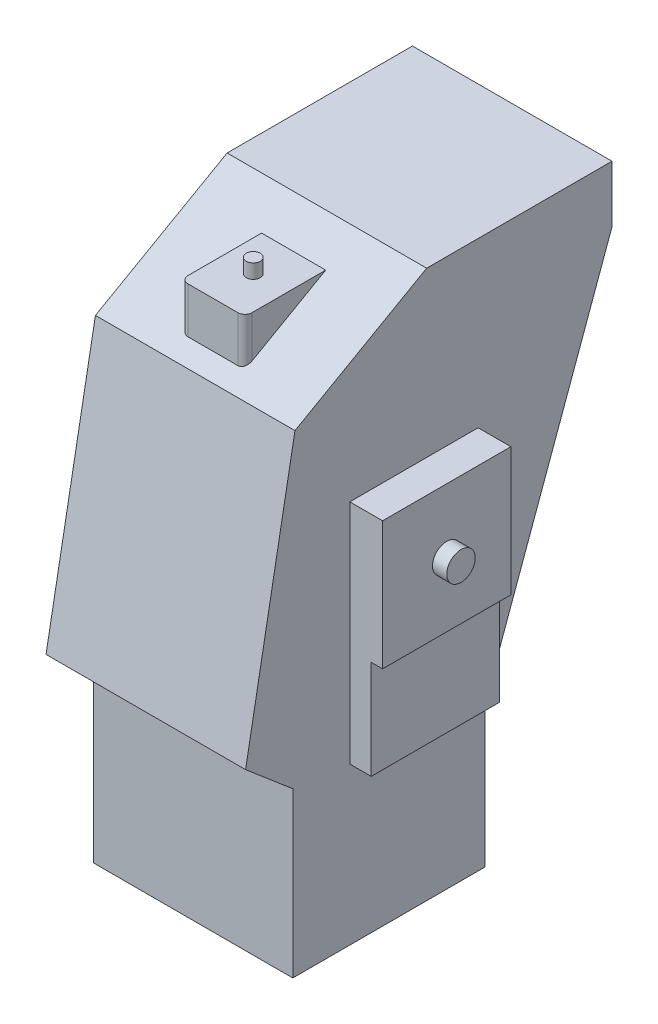
ISO-10303-21;
HEADER;
FILE_DESCRIPTION(('STEP AP214'),'2;1');
FILE_NAME('part.step','',(''),(''),'','','');
FILE_SCHEMA(('AUTOMOTIVE_DESIGN { 1 0 10303 214 1 1 1 1 }'));
ENDSEC;
DATA;
#1=APPLICATION_CONTEXT('core data for automotive mechanical design processes');
#2=APPLICATION_PROTOCOL_DEFINITION('international standard','automotive_design',2000,#1);
#3=PRODUCT_CONTEXT('',#1,'mechanical');
#4=PRODUCT('Part','Part','',(#3));
#5=PRODUCT_RELATED_PRODUCT_CATEGORY('part','',(#4));
#6=PRODUCT_DEFINITION_FORMATION('','',#4);
#7=PRODUCT_DEFINITION_CONTEXT('part definition',#1,'design');
#8=PRODUCT_DEFINITION('design','',#6,#7);
#9=PRODUCT_DEFINITION_SHAPE('','',#8);
#10=(LENGTH_UNIT() NAMED_UNIT(*) SI_UNIT(.MILLI.,.METRE.));
#11=(NAMED_UNIT(*) PLANE_ANGLE_UNIT() SI_UNIT($,.RADIAN.));
#12=(NAMED_UNIT(*) SI_UNIT($,.STERADIAN.) SOLID_ANGLE_UNIT());
#13=UNCERTAINTY_MEASURE_WITH_UNIT(LENGTH_MEASURE(1.E-05),#10,'distance_accuracy_value','');
#14=(GEOMETRIC_REPRESENTATION_CONTEXT(3) GLOBAL_UNCERTAINTY_ASSIGNED_CONTEXT((#13)) GLOBAL_UNIT_ASSIGNED_CONTEXT((#10,
#11,#12)) REPRESENTATION_CONTEXT('',''));
#15=CARTESIAN_POINT('',(0.,0.,0.));
#16=DIRECTION('',(0.,0.,1.));
#17=DIRECTION('',(1.,0.,0.));
#18=AXIS2_PLACEMENT_3D('',#15,#16,#17);
#19=CARTESIAN_POINT('',(23.,0.,0.));
#20=DIRECTION('',(1.,0.,0.));
#21=DIRECTION('',(0.,0.,-1.));
#22=AXIS2_PLACEMENT_3D('',#19,#20,#21);
#23=PLANE('',#22);
#24=DIRECTION('',(0.,-1.,0.));
#25=VECTOR('',#24,1.);
#26=CARTESIAN_POINT('',(23.,149.999954134958,82.5759610045894));
#27=LINE('',#26,#25);
#28=CARTESIAN_POINT('',(23.,149.999954134958,82.5759610045894));
#29=VERTEX_POINT('',#28);
#30=CARTESIAN_POINT('',(23.,59.9999541349582,82.5759610045894));
#31=VERTEX_POINT('',#30);
#32=EDGE_CURVE('E282',#29,#31,#27,.T.);
#33=ORIENTED_EDGE('',*,*,#32,.T.);
#34=DIRECTION('',(0.,0.,-1.));
#35=VECTOR('',#34,1.);
#36=CARTESIAN_POINT('',(23.,59.9999541349582,82.5759610045894));
#37=LINE('',#36,#35);
#38=CARTESIAN_POINT('',(23.,59.9999541349582,-7.42403899541063));
#39=VERTEX_POINT('',#38);
#40=EDGE_CURVE('E285',#31,#39,#37,.T.);
#41=ORIENTED_EDGE('',*,*,#40,.T.);
#42=DIRECTION('',(0.,1.,0.));
#43=VECTOR('',#42,1.);
#44=CARTESIAN_POINT('',(23.,149.999954134958,-7.42403899541062));
#45=LINE('',#44,#43);
#46=CARTESIAN_POINT('',(23.,149.999954134958,-7.42403899541062));
#47=VERTEX_POINT('',#46);
#48=EDGE_CURVE('E287',#39,#47,#45,.T.);
#49=ORIENTED_EDGE('',*,*,#48,.T.);
#50=DIRECTION('',(0.,0.,1.));
#51=VECTOR('',#50,1.);
#52=CARTESIAN_POINT('',(23.,149.999954134958,82.5759610045894));
#53=LINE('',#52,#51);
#54=EDGE_CURVE('E290',#47,#29,#53,.T.);
#55=ORIENTED_EDGE('',*,*,#54,.T.);
#56=EDGE_LOOP('',(#33,#41,#49,#55));
#57=FACE_BOUND('',#56,.T.);
#58=CARTESIAN_POINT('',(23.,104.999954134958,37.5759610045894));
#59=DIRECTION('',(1.,0.,0.));
#60=DIRECTION('',(0.,0.,-1.));
#61=AXIS2_PLACEMENT_3D('',#58,#59,#60);
#62=CIRCLE('',#61,10.);
#63=CARTESIAN_POINT('',(23.,104.999954134958,27.5759610045894));
#64=VERTEX_POINT('',#63);
#65=EDGE_CURVE('E275',#64,#64,#62,.T.);
#66=ORIENTED_EDGE('',*,*,#65,.F.);
#67=EDGE_LOOP('',(#66));
#68=FACE_BOUND('',#67,.T.);
#69=ADVANCED_FACE('F32',(#57,#68),#23,.T.);
#70=CARTESIAN_POINT('',(15.,0.,0.));
#71=DIRECTION('',(-1.,0.,0.));
#72=DIRECTION('',(0.,0.,1.));
#73=AXIS2_PLACEMENT_3D('',#70,#71,#72);
#74=PLANE('',#73);
#75=DIRECTION('',(0.,0.,-1.));
#76=VECTOR('',#75,1.);
#77=CARTESIAN_POINT('',(15.,59.9999541349582,82.5759610045894));
#78=LINE('',#77,#76);
#79=CARTESIAN_POINT('',(15.,59.9999541349582,82.5759610045894));
#80=VERTEX_POINT('',#79);
#81=CARTESIAN_POINT('',(15.,59.9999541349582,-7.42403899541063));
#82=VERTEX_POINT('',#81);
#83=EDGE_CURVE('E279',#80,#82,#78,.T.);
#84=ORIENTED_EDGE('',*,*,#83,.F.);
#85=DIRECTION('',(0.,-1.,0.));
#86=VECTOR('',#85,1.);
#87=CARTESIAN_POINT('',(15.,149.999954134958,82.5759610045894));
#88=LINE('',#87,#86);
#89=CARTESIAN_POINT('',(15.,-9.32012726937813,82.5759610045894));
#90=VERTEX_POINT('',#89);
#91=EDGE_CURVE('E302',#80,#90,#88,.T.);
#92=ORIENTED_EDGE('',*,*,#91,.T.);
#93=DIRECTION('',(0.,0.,-1.));
#94=VECTOR('',#93,1.);
#95=CARTESIAN_POINT('',(15.,-9.32012726937811,-7.42403899541063));
#96=LINE('',#95,#94);
#97=CARTESIAN_POINT('',(15.,-9.32012726937811,-7.42403899541063));
#98=VERTEX_POINT('',#97);
#99=EDGE_CURVE('E325',#90,#98,#96,.T.);
#100=ORIENTED_EDGE('',*,*,#99,.T.);
#101=DIRECTION('',(0.,1.,0.));
#102=VECTOR('',#101,1.);
#103=CARTESIAN_POINT('',(15.,149.999954134958,-7.42403899541061));
#104=LINE('',#103,#102);
#105=EDGE_CURVE('E331',#98,#82,#104,.T.);
#106=ORIENTED_EDGE('',*,*,#105,.T.);
#107=EDGE_LOOP('',(#84,#92,#100,#106));
#108=FACE_BOUND('',#107,.T.);
#109=ADVANCED_FACE('F460',(#108),#74,.F.);
#110=CARTESIAN_POINT('',(0.,0.,0.));
#111=DIRECTION('',(1.,0.,0.));
#112=DIRECTION('',(0.,0.,-1.));
#113=AXIS2_PLACEMENT_3D('',#110,#111,#112);
#114=PLANE('',#113);
#115=DIRECTION('',(0.,-0.493861860804956,0.869540374245076));
#116=VECTOR('',#115,1.);
#117=CARTESIAN_POINT('',(0.,212.517254187215,121.05677931094));
#118=LINE('',#117,#116);
#119=CARTESIAN_POINT('',(0.,264.999954134958,28.6507237399155));
#120=VERTEX_POINT('',#119);
#121=CARTESIAN_POINT('',(0.,212.517254187215,121.05677931094));
#122=VERTEX_POINT('',#121);
#123=EDGE_CURVE('E366',#120,#122,#118,.T.);
#124=ORIENTED_EDGE('',*,*,#123,.T.);
#125=DIRECTION('',(0.,-0.983554856780202,0.180609644548892));
#126=VECTOR('',#125,1.);
#127=CARTESIAN_POINT('',(0.,23.8419260110692,155.703127424754));
#128=LINE('',#127,#126);
#129=CARTESIAN_POINT('',(0.,23.8419260110692,155.703127424754));
#130=VERTEX_POINT('',#129);
#131=EDGE_CURVE('E398',#122,#130,#128,.T.);
#132=ORIENTED_EDGE('',*,*,#131,.T.);
#133=DIRECTION('',(0.,-0.647701317397593,-0.761894351889697));
#134=VECTOR('',#133,1.);
#135=CARTESIAN_POINT('',(0.,-4.32012726937812,122.575961004589));
#136=LINE('',#135,#134);
#137=CARTESIAN_POINT('',(0.,-4.32012726937812,122.575961004589));
#138=VERTEX_POINT('',#137);
#139=EDGE_CURVE('E401',#130,#138,#136,.T.);
#140=ORIENTED_EDGE('',*,*,#139,.T.);
#141=DIRECTION('',(0.,-1.,0.));
#142=VECTOR('',#141,1.);
#143=CARTESIAN_POINT('',(0.,-119.320127269378,122.575961004589));
#144=LINE('',#143,#142);
#145=CARTESIAN_POINT('',(0.,-119.320127269378,122.575961004589));
#146=VERTEX_POINT('',#145);
#147=EDGE_CURVE('E404',#138,#146,#144,.T.);
#148=ORIENTED_EDGE('',*,*,#147,.T.);
#149=DIRECTION('',(0.,0.,-1.));
#150=VECTOR('',#149,1.);
#151=CARTESIAN_POINT('',(0.,-119.320127269378,-12.4240389954106));
#152=LINE('',#151,#150);
#153=CARTESIAN_POINT('',(0.,-119.320127269378,-12.4240389954106));
#154=VERTEX_POINT('',#153);
#155=EDGE_CURVE('E407',#146,#154,#152,.T.);
#156=ORIENTED_EDGE('',*,*,#155,.T.);
#157=DIRECTION('',(0.,1.,0.));
#158=VECTOR('',#157,1.);
#159=CARTESIAN_POINT('',(0.,-19.320127269378,-12.4240389954105));
#160=LINE('',#159,#158);
#161=CARTESIAN_POINT('',(0.,-19.320127269378,-12.4240389954105));
#162=VERTEX_POINT('',#161);
#163=EDGE_CURVE('E410',#154,#162,#160,.T.);
#164=ORIENTED_EDGE('',*,*,#163,.T.);
#165=DIRECTION('',(0.,0.939692620785908,-0.342020143325669));
#166=VECTOR('',#165,1.);
#167=CARTESIAN_POINT('',(0.,224.999954134958,-101.349276260085));
#168=LINE('',#167,#166);
#169=CARTESIAN_POINT('',(0.,224.999954134958,-101.349276260085));
#170=VERTEX_POINT('',#169);
#171=EDGE_CURVE('E413',#162,#170,#168,.T.);
#172=ORIENTED_EDGE('',*,*,#171,.T.);
#173=DIRECTION('',(0.,1.,0.));
#174=VECTOR('',#173,1.);
#175=CARTESIAN_POINT('',(0.,264.999954134958,-101.349276260085));
#176=LINE('',#175,#174);
#177=CARTESIAN_POINT('',(0.,264.999954134958,-101.349276260085));
#178=VERTEX_POINT('',#177);
#179=EDGE_CURVE('E416',#170,#178,#176,.T.);
#180=ORIENTED_EDGE('',*,*,#179,.T.);
#181=DIRECTION('',(0.,0.,1.));
#182=VECTOR('',#181,1.);
#183=CARTESIAN_POINT('',(0.,264.999954134958,28.6507237399155));
#184=LINE('',#183,#182);
#185=EDGE_CURVE('E371',#178,#120,#184,.T.);
#186=ORIENTED_EDGE('',*,*,#185,.T.);
#187=EDGE_LOOP('',(#124,#132,#140,#148,#156,#164,#172,#180,#186));
#188=FACE_BOUND('',#187,.T.);
#189=DIRECTION('',(0.,0.,1.));
#190=VECTOR('',#189,1.);
#191=CARTESIAN_POINT('',(0.,149.999954134958,-7.42403899541061));
#192=LINE('',#191,#190);
#193=CARTESIAN_POINT('',(0.,149.999954134958,-7.42403899541061));
#194=VERTEX_POINT('',#193);
#195=CARTESIAN_POINT('',(0.,149.999954134958,82.5759610045894));
#196=VERTEX_POINT('',#195);
#197=EDGE_CURVE('E316',#194,#196,#192,.T.);
#198=ORIENTED_EDGE('',*,*,#197,.F.);
#199=DIRECTION('',(0.,1.,0.));
#200=VECTOR('',#199,1.);
#201=CARTESIAN_POINT('',(0.,149.999954134958,-7.42403899541061));
#202=LINE('',#201,#200);
#203=CARTESIAN_POINT('',(0.,-9.32012726937811,-7.42403899541063));
#204=VERTEX_POINT('',#203);
#205=EDGE_CURVE('E311',#204,#194,#202,.T.);
#206=ORIENTED_EDGE('',*,*,#205,.F.);
#207=DIRECTION('',(0.,0.,-1.));
#208=VECTOR('',#207,1.);
#209=CARTESIAN_POINT('',(0.,-9.32012726937811,-7.42403899541063));
#210=LINE('',#209,#208);
#211=CARTESIAN_POINT('',(0.,-9.32012726937813,82.5759610045894));
#212=VERTEX_POINT('',#211);
#213=EDGE_CURVE('E329',#212,#204,#210,.T.);
#214=ORIENTED_EDGE('',*,*,#213,.F.);
#215=DIRECTION('',(0.,-1.,0.));
#216=VECTOR('',#215,1.);
#217=CARTESIAN_POINT('',(0.,149.999954134958,82.5759610045894));
#218=LINE('',#217,#216);
#219=EDGE_CURVE('E322',#196,#212,#218,.T.);
#220=ORIENTED_EDGE('',*,*,#219,.F.);
#221=EDGE_LOOP('',(#198,#206,#214,#220));
#222=FACE_BOUND('',#221,.T.);
#223=ADVANCED_FACE('F473',(#188,#222),#114,.T.);
#224=CARTESIAN_POINT('',(0.,251.749954134958,4.65830992548263E-13));
#225=DIRECTION('',(0.,1.,0.));
#226=DIRECTION('',(0.,0.,1.));
#227=AXIS2_PLACEMENT_3D('',#224,#225,#226);
#228=PLANE('',#227);
#229=DIRECTION('',(1.,0.,0.));
#230=VECTOR('',#229,1.);
#231=CARTESIAN_POINT('',(-47.5,251.749954134958,108.650723739915));
#232=LINE('',#231,#230);
#233=CARTESIAN_POINT('',(-87.5,251.749954134958,108.650723739915));
#234=VERTEX_POINT('',#233);
#235=CARTESIAN_POINT('',(-52.5,251.749954134958,108.650723739915));
#236=VERTEX_POINT('',#235);
#237=EDGE_CURVE('E360',#234,#236,#232,.T.);
#238=ORIENTED_EDGE('',*,*,#237,.T.);
#239=CARTESIAN_POINT('',(-52.5,251.749954134958,103.650723739915));
#240=DIRECTION('',(0.,1.,0.));
#241=DIRECTION('',(0.,0.,1.));
#242=AXIS2_PLACEMENT_3D('',#239,#240,#241);
#243=CIRCLE('',#242,5.);
#244=CARTESIAN_POINT('',(-47.5,251.749954134958,103.650723739915));
#245=VERTEX_POINT('',#244);
#246=EDGE_CURVE('E445',#236,#245,#243,.T.);
#247=ORIENTED_EDGE('',*,*,#246,.T.);
#248=DIRECTION('',(0.,0.,-1.));
#249=VECTOR('',#248,1.);
#250=CARTESIAN_POINT('',(-47.5,251.749954134958,108.650723739915));
#251=LINE('',#250,#249);
#252=CARTESIAN_POINT('',(-47.5,251.749954134958,51.9799396060045));
#253=VERTEX_POINT('',#252);
#254=EDGE_CURVE('E357',#245,#253,#251,.T.);
#255=ORIENTED_EDGE('',*,*,#254,.T.);
#256=DIRECTION('',(1.,0.,0.));
#257=VECTOR('',#256,1.);
#258=CARTESIAN_POINT('',(0.,251.749954134958,51.9799396060045));
#259=LINE('',#258,#257);
#260=CARTESIAN_POINT('',(-92.5,251.749954134958,51.9799396060045));
#261=VERTEX_POINT('',#260);
#262=EDGE_CURVE('E354',#261,#253,#259,.T.);
#263=ORIENTED_EDGE('',*,*,#262,.F.);
#264=DIRECTION('',(0.,0.,1.));
#265=VECTOR('',#264,1.);
#266=CARTESIAN_POINT('',(-92.5,251.749954134958,108.650723739915));
#267=LINE('',#266,#265);
#268=CARTESIAN_POINT('',(-92.5,251.749954134958,103.650723739915));
#269=VERTEX_POINT('',#268);
#270=EDGE_CURVE('E345',#261,#269,#267,.T.);
#271=ORIENTED_EDGE('',*,*,#270,.T.);
#272=CARTESIAN_POINT('',(-87.5,251.749954134958,103.650723739915));
#273=DIRECTION('',(0.,1.,0.));
#274=DIRECTION('',(0.,0.,1.));
#275=AXIS2_PLACEMENT_3D('',#272,#273,#274);
#276=CIRCLE('',#275,5.);
#277=EDGE_CURVE('E443',#269,#234,#276,.T.);
#278=ORIENTED_EDGE('',*,*,#277,.T.);
#279=EDGE_LOOP('',(#238,#247,#255,#263,#271,#278));
#280=FACE_BOUND('',#279,.T.);
#281=CARTESIAN_POINT('',(-70.7322330470336,251.749954134958,79.5830986259263));
#282=DIRECTION('',(0.,1.,0.));
#283=DIRECTION('',(0.,0.,1.));
#284=AXIS2_PLACEMENT_3D('',#281,#282,#283);
#285=CIRCLE('',#284,4.9);
#286=CARTESIAN_POINT('',(-70.7322330470336,251.749954134958,84.4830986259263));
#287=VERTEX_POINT('',#286);
#288=EDGE_CURVE('E341',#287,#287,#285,.T.);
#289=ORIENTED_EDGE('',*,*,#288,.F.);
#290=EDGE_LOOP('',(#289));
#291=FACE_BOUND('',#290,.T.);
#292=ADVANCED_FACE('F517',(#280,#291),#228,.T.);
#293=CARTESIAN_POINT('',(-140.,212.517254187215,121.05677931094));
#294=DIRECTION('',(0.,0.869540374245076,0.493861860804956));
#295=DIRECTION('',(0.,-0.493861860804956,0.869540374245076));
#296=AXIS2_PLACEMENT_3D('',#293,#294,#295);
#297=PLANE('',#296);
#298=DIRECTION('',(0.,-0.493861860804956,0.869540374245076));
#299=VECTOR('',#298,1.);
#300=CARTESIAN_POINT('',(-47.5,204.054400280119,135.957288415983));
#301=LINE('',#300,#299);
#302=CARTESIAN_POINT('',(-47.5,222.403151666149,103.650723739915));
#303=VERTEX_POINT('',#302);
#304=EDGE_CURVE('E348',#253,#303,#301,.T.);
#305=ORIENTED_EDGE('',*,*,#304,.T.);
#306=CARTESIAN_POINT('',(-52.5,222.403151666149,103.650723739915));
#307=DIRECTION('',(0.,0.869540374245076,0.493861860804956));
#308=DIRECTION('',(0.,0.493861860804956,-0.869540374245076));
#309=AXIS2_PLACEMENT_3D('',#306,#307,#308);
#310=ELLIPSE('',#309,5.75016427999785,5.);
#311=CARTESIAN_POINT('',(-52.5,219.563364834895,108.650723739915));
#312=VERTEX_POINT('',#311);
#313=EDGE_CURVE('E452',#303,#312,#310,.F.);
#314=ORIENTED_EDGE('',*,*,#313,.T.);
#315=DIRECTION('',(-1.,0.,0.));
#316=VECTOR('',#315,1.);
#317=CARTESIAN_POINT('',(-47.5,219.563364834895,108.650723739915));
#318=LINE('',#317,#316);
#319=CARTESIAN_POINT('',(-87.5,219.563364834895,108.650723739915));
#320=VERTEX_POINT('',#319);
#321=EDGE_CURVE('E352',#312,#320,#318,.T.);
#322=ORIENTED_EDGE('',*,*,#321,.T.);
#323=CARTESIAN_POINT('',(-87.5,222.403151666149,103.650723739915));
#324=DIRECTION('',(0.,0.869540374245076,0.493861860804956));
#325=DIRECTION('',(0.,0.493861860804956,-0.869540374245076));
#326=AXIS2_PLACEMENT_3D('',#323,#324,#325);
#327=ELLIPSE('',#326,5.75016427999785,5.);
#328=CARTESIAN_POINT('',(-92.5,222.403151666149,103.650723739915));
#329=VERTEX_POINT('',#328);
#330=EDGE_CURVE('E40',#320,#329,#327,.F.);
#331=ORIENTED_EDGE('',*,*,#330,.T.);
#332=DIRECTION('',(0.,0.493861860804956,-0.869540374245076));
#333=VECTOR('',#332,1.);
#334=CARTESIAN_POINT('',(-92.5,204.054400280119,135.957288415983));
#335=LINE('',#334,#333);
#336=EDGE_CURVE('E351',#329,#261,#335,.T.);
#337=ORIENTED_EDGE('',*,*,#336,.T.);
#338=ORIENTED_EDGE('',*,*,#262,.T.);
#339=EDGE_LOOP('',(#305,#314,#322,#331,#337,#338));
#340=FACE_BOUND('',#339,.T.);
#341=ORIENTED_EDGE('',*,*,#123,.F.);
#342=DIRECTION('',(1.,0.,0.));
#343=VECTOR('',#342,1.);
#344=CARTESIAN_POINT('',(-140.,264.999954134958,28.6507237399155));
#345=LINE('',#344,#343);
#346=CARTESIAN_POINT('',(-140.,264.999954134958,28.6507237399155));
#347=VERTEX_POINT('',#346);
#348=EDGE_CURVE('E421',#347,#120,#345,.T.);
#349=ORIENTED_EDGE('',*,*,#348,.F.);
#350=DIRECTION('',(0.,-0.493861860804956,0.869540374245076));
#351=VECTOR('',#350,1.);
#352=CARTESIAN_POINT('',(-140.,212.517254187215,121.05677931094));
#353=LINE('',#352,#351);
#354=CARTESIAN_POINT('',(-140.,212.517254187215,121.05677931094));
#355=VERTEX_POINT('',#354);
#356=EDGE_CURVE('E367',#347,#355,#353,.T.);
#357=ORIENTED_EDGE('',*,*,#356,.T.);
#358=DIRECTION('',(1.,0.,0.));
#359=VECTOR('',#358,1.);
#360=CARTESIAN_POINT('',(-140.,212.517254187215,121.05677931094));
#361=LINE('',#360,#359);
#362=EDGE_CURVE('E395',#355,#122,#361,.T.);
#363=ORIENTED_EDGE('',*,*,#362,.T.);
#364=EDGE_LOOP('',(#341,#349,#357,#363));
#365=FACE_BOUND('',#364,.T.);
#366=ADVANCED_FACE('F520',(#340,#365),#297,.T.);
#367=CARTESIAN_POINT('',(-140.,264.999954134958,28.6507237399155));
#368=DIRECTION('',(0.,1.,0.));
#369=DIRECTION('',(0.,0.,1.));
#370=AXIS2_PLACEMENT_3D('',#367,#368,#369);
#371=PLANE('',#370);
#372=ORIENTED_EDGE('',*,*,#185,.F.);
#373=DIRECTION('',(1.,0.,0.));
#374=VECTOR('',#373,1.);
#375=CARTESIAN_POINT('',(-140.,264.999954134958,-101.349276260085));
#376=LINE('',#375,#374);
#377=CARTESIAN_POINT('',(-140.,264.999954134958,-101.349276260085));
#378=VERTEX_POINT('',#377);
#379=EDGE_CURVE('E424',#378,#178,#376,.T.);
#380=ORIENTED_EDGE('',*,*,#379,.F.);
#381=DIRECTION('',(0.,0.,1.));
#382=VECTOR('',#381,1.);
#383=CARTESIAN_POINT('',(-140.,264.999954134958,28.6507237399155));
#384=LINE('',#383,#382);
#385=EDGE_CURVE('E392',#378,#347,#384,.T.);
#386=ORIENTED_EDGE('',*,*,#385,.T.);
#387=ORIENTED_EDGE('',*,*,#348,.T.);
#388=EDGE_LOOP('',(#372,#380,#386,#387));
#389=FACE_BOUND('',#388,.T.);
#390=ADVANCED_FACE('F543',(#389),#371,.T.);
#391=CARTESIAN_POINT('',(-140.,264.999954134958,-101.349276260085));
#392=DIRECTION('',(0.,0.,-1.));
#393=DIRECTION('',(-1.,0.,0.));
#394=AXIS2_PLACEMENT_3D('',#391,#392,#393);
#395=PLANE('',#394);
#396=ORIENTED_EDGE('',*,*,#179,.F.);
#397=DIRECTION('',(1.,0.,0.));
#398=VECTOR('',#397,1.);
#399=CARTESIAN_POINT('',(-140.,224.999954134958,-101.349276260085));
#400=LINE('',#399,#398);
#401=CARTESIAN_POINT('',(-140.,224.999954134958,-101.349276260085));
#402=VERTEX_POINT('',#401);
#403=EDGE_CURVE('E426',#402,#170,#400,.T.);
#404=ORIENTED_EDGE('',*,*,#403,.F.);
#405=DIRECTION('',(0.,1.,0.));
#406=VECTOR('',#405,1.);
#407=CARTESIAN_POINT('',(-140.,264.999954134958,-101.349276260085));
#408=LINE('',#407,#406);
#409=EDGE_CURVE('E389',#402,#378,#408,.T.);
#410=ORIENTED_EDGE('',*,*,#409,.T.);
#411=ORIENTED_EDGE('',*,*,#379,.T.);
#412=EDGE_LOOP('',(#396,#404,#410,#411));
#413=FACE_BOUND('',#412,.T.);
#414=ADVANCED_FACE('F546',(#413),#395,.T.);
#415=CARTESIAN_POINT('',(-140.,224.999954134958,-101.349276260085));
#416=DIRECTION('',(0.,-0.342020143325669,-0.939692620785908));
#417=DIRECTION('',(0.,0.939692620785908,-0.342020143325669));
#418=AXIS2_PLACEMENT_3D('',#415,#416,#417);
#419=PLANE('',#418);
#420=ORIENTED_EDGE('',*,*,#171,.F.);
#421=DIRECTION('',(1.,0.,0.));
#422=VECTOR('',#421,1.);
#423=CARTESIAN_POINT('',(-140.,-19.320127269378,-12.4240389954105));
#424=LINE('',#423,#422);
#425=CARTESIAN_POINT('',(-140.,-19.320127269378,-12.4240389954105));
#426=VERTEX_POINT('',#425);
#427=EDGE_CURVE('E428',#426,#162,#424,.T.);
#428=ORIENTED_EDGE('',*,*,#427,.F.);
#429=DIRECTION('',(0.,0.939692620785908,-0.342020143325669));
#430=VECTOR('',#429,1.);
#431=CARTESIAN_POINT('',(-140.,224.999954134958,-101.349276260085));
#432=LINE('',#431,#430);
#433=EDGE_CURVE('E386',#426,#402,#432,.T.);
#434=ORIENTED_EDGE('',*,*,#433,.T.);
#435=ORIENTED_EDGE('',*,*,#403,.T.);
#436=EDGE_LOOP('',(#420,#428,#434,#435));
#437=FACE_BOUND('',#436,.T.);
#438=ADVANCED_FACE('F550',(#437),#419,.T.);
#439=CARTESIAN_POINT('',(-140.,-19.320127269378,-12.4240389954105));
#440=DIRECTION('',(0.,0.,-1.));
#441=DIRECTION('',(0.,1.,0.));
#442=AXIS2_PLACEMENT_3D('',#439,#440,#441);
#443=PLANE('',#442);
#444=ORIENTED_EDGE('',*,*,#163,.F.);
#445=DIRECTION('',(1.,0.,0.));
#446=VECTOR('',#445,1.);
#447=CARTESIAN_POINT('',(-140.,-119.320127269378,-12.4240389954106));
#448=LINE('',#447,#446);
#449=CARTESIAN_POINT('',(-140.,-119.320127269378,-12.4240389954106));
#450=VERTEX_POINT('',#449);
#451=EDGE_CURVE('E430',#450,#154,#448,.T.);
#452=ORIENTED_EDGE('',*,*,#451,.F.);
#453=DIRECTION('',(0.,1.,0.));
#454=VECTOR('',#453,1.);
#455=CARTESIAN_POINT('',(-140.,-19.320127269378,-12.4240389954105));
#456=LINE('',#455,#454);
#457=EDGE_CURVE('E383',#450,#426,#456,.T.);
#458=ORIENTED_EDGE('',*,*,#457,.T.);
#459=ORIENTED_EDGE('',*,*,#427,.T.);
#460=EDGE_LOOP('',(#444,#452,#458,#459));
#461=FACE_BOUND('',#460,.T.);
#462=ADVANCED_FACE('F554',(#461),#443,.T.);
#463=CARTESIAN_POINT('',(-140.,-119.320127269378,-12.4240389954106));
#464=DIRECTION('',(0.,-1.,0.));
#465=DIRECTION('',(0.,0.,-1.));
#466=AXIS2_PLACEMENT_3D('',#463,#464,#465);
#467=PLANE('',#466);
#468=ORIENTED_EDGE('',*,*,#155,.F.);
#469=DIRECTION('',(1.,0.,0.));
#470=VECTOR('',#469,1.);
#471=CARTESIAN_POINT('',(-140.,-119.320127269378,122.575961004589));
#472=LINE('',#471,#470);
#473=CARTESIAN_POINT('',(-140.,-119.320127269378,122.575961004589));
#474=VERTEX_POINT('',#473);
#475=EDGE_CURVE('E432',#474,#146,#472,.T.);
#476=ORIENTED_EDGE('',*,*,#475,.F.);
#477=DIRECTION('',(0.,0.,-1.));
#478=VECTOR('',#477,1.);
#479=CARTESIAN_POINT('',(-140.,-119.320127269378,-12.4240389954106));
#480=LINE('',#479,#478);
#481=EDGE_CURVE('E380',#474,#450,#480,.T.);
#482=ORIENTED_EDGE('',*,*,#481,.T.);
#483=ORIENTED_EDGE('',*,*,#451,.T.);
#484=EDGE_LOOP('',(#468,#476,#482,#483));
#485=FACE_BOUND('',#484,.T.);
#486=ADVANCED_FACE('F558',(#485),#467,.T.);
#487=CARTESIAN_POINT('',(-140.,-119.320127269378,122.575961004589));
#488=DIRECTION('',(0.,0.,1.));
#489=DIRECTION('',(0.,-1.,0.));
#490=AXIS2_PLACEMENT_3D('',#487,#488,#489);
#491=PLANE('',#490);
#492=ORIENTED_EDGE('',*,*,#147,.F.);
#493=DIRECTION('',(1.,0.,0.));
#494=VECTOR('',#493,1.);
#495=CARTESIAN_POINT('',(-140.,-4.32012726937812,122.575961004589));
#496=LINE('',#495,#494);
#497=CARTESIAN_POINT('',(-140.,-4.32012726937812,122.575961004589));
#498=VERTEX_POINT('',#497);
#499=EDGE_CURVE('E434',#498,#138,#496,.T.);
#500=ORIENTED_EDGE('',*,*,#499,.F.);
#501=DIRECTION('',(0.,-1.,0.));
#502=VECTOR('',#501,1.);
#503=CARTESIAN_POINT('',(-140.,-119.320127269378,122.575961004589));
#504=LINE('',#503,#502);
#505=EDGE_CURVE('E377',#498,#474,#504,.T.);
#506=ORIENTED_EDGE('',*,*,#505,.T.);
#507=ORIENTED_EDGE('',*,*,#475,.T.);
#508=EDGE_LOOP('',(#492,#500,#506,#507));
#509=FACE_BOUND('',#508,.T.);
#510=ADVANCED_FACE('F562',(#509),#491,.T.);
#511=CARTESIAN_POINT('',(-140.,-4.32012726937812,122.575961004589));
#512=DIRECTION('',(0.,-0.761894351889697,0.647701317397594));
#513=DIRECTION('',(0.,-0.647701317397594,-0.761894351889697));
#514=AXIS2_PLACEMENT_3D('',#511,#512,#513);
#515=PLANE('',#514);
#516=ORIENTED_EDGE('',*,*,#139,.F.);
#517=DIRECTION('',(1.,0.,0.));
#518=VECTOR('',#517,1.);
#519=CARTESIAN_POINT('',(-140.,23.8419260110692,155.703127424754));
#520=LINE('',#519,#518);
#521=CARTESIAN_POINT('',(-140.,23.8419260110692,155.703127424754));
#522=VERTEX_POINT('',#521);
#523=EDGE_CURVE('E436',#522,#130,#520,.T.);
#524=ORIENTED_EDGE('',*,*,#523,.F.);
#525=DIRECTION('',(0.,-0.647701317397593,-0.761894351889697));
#526=VECTOR('',#525,1.);
#527=CARTESIAN_POINT('',(-140.,-4.32012726937812,122.575961004589));
#528=LINE('',#527,#526);
#529=EDGE_CURVE('E374',#522,#498,#528,.T.);
#530=ORIENTED_EDGE('',*,*,#529,.T.);
#531=ORIENTED_EDGE('',*,*,#499,.T.);
#532=EDGE_LOOP('',(#516,#524,#530,#531));
#533=FACE_BOUND('',#532,.T.);
#534=ADVANCED_FACE('F566',(#533),#515,.T.);
#535=CARTESIAN_POINT('',(-140.,23.8419260110692,155.703127424754));
#536=DIRECTION('',(0.,0.180609644548892,0.983554856780202));
#537=DIRECTION('',(0.,-0.983554856780202,0.180609644548892));
#538=AXIS2_PLACEMENT_3D('',#535,#536,#537);
#539=PLANE('',#538);
#540=ORIENTED_EDGE('',*,*,#131,.F.);
#541=ORIENTED_EDGE('',*,*,#362,.F.);
#542=DIRECTION('',(0.,-0.983554856780202,0.180609644548892));
#543=VECTOR('',#542,1.);
#544=CARTESIAN_POINT('',(-140.,23.8419260110692,155.703127424754));
#545=LINE('',#544,#543);
#546=EDGE_CURVE('E370',#355,#522,#545,.T.);
#547=ORIENTED_EDGE('',*,*,#546,.T.);
#548=ORIENTED_EDGE('',*,*,#523,.T.);
#549=EDGE_LOOP('',(#540,#541,#547,#548));
#550=FACE_BOUND('',#549,.T.);
#551=ADVANCED_FACE('F538',(#550),#539,.T.);
#552=CARTESIAN_POINT('',(-140.,0.,0.));
#553=DIRECTION('',(1.,0.,0.));
#554=DIRECTION('',(0.,0.,-1.));
#555=AXIS2_PLACEMENT_3D('',#552,#553,#554);
#556=PLANE('',#555);
#557=DIRECTION('',(0.,0.,-1.));
#558=VECTOR('',#557,1.);
#559=CARTESIAN_POINT('',(-140.,-9.32012726937811,-7.42403899541063));
#560=LINE('',#559,#558);
#561=CARTESIAN_POINT('',(-140.,-9.32012726937813,82.5759610045894));
#562=VERTEX_POINT('',#561);
#563=CARTESIAN_POINT('',(-140.,-9.32012726937811,-7.42403899541063));
#564=VERTEX_POINT('',#563);
#565=EDGE_CURVE('E267',#562,#564,#560,.T.);
#566=ORIENTED_EDGE('',*,*,#565,.T.);
#567=DIRECTION('',(0.,1.,0.));
#568=VECTOR('',#567,1.);
#569=CARTESIAN_POINT('',(-140.,149.999954134958,-7.42403899541061));
#570=LINE('',#569,#568);
#571=CARTESIAN_POINT('',(-140.,149.999954134958,-7.42403899541061));
#572=VERTEX_POINT('',#571);
#573=EDGE_CURVE('E245',#564,#572,#570,.T.);
#574=ORIENTED_EDGE('',*,*,#573,.T.);
#575=DIRECTION('',(0.,0.,1.));
#576=VECTOR('',#575,1.);
#577=CARTESIAN_POINT('',(-140.,149.999954134958,-7.42403899541061));
#578=LINE('',#577,#576);
#579=CARTESIAN_POINT('',(-140.,149.999954134958,82.5759610045894));
#580=VERTEX_POINT('',#579);
#581=EDGE_CURVE('E262',#572,#580,#578,.T.);
#582=ORIENTED_EDGE('',*,*,#581,.T.);
#583=DIRECTION('',(0.,-1.,0.));
#584=VECTOR('',#583,1.);
#585=CARTESIAN_POINT('',(-140.,149.999954134958,82.5759610045894));
#586=LINE('',#585,#584);
#587=EDGE_CURVE('E55',#580,#562,#586,.T.);
#588=ORIENTED_EDGE('',*,*,#587,.T.);
#589=EDGE_LOOP('',(#566,#574,#582,#588));
#590=FACE_BOUND('',#589,.T.);
#591=ORIENTED_EDGE('',*,*,#356,.F.);
#592=ORIENTED_EDGE('',*,*,#385,.F.);
#593=ORIENTED_EDGE('',*,*,#409,.F.);
#594=ORIENTED_EDGE('',*,*,#433,.F.);
#595=ORIENTED_EDGE('',*,*,#457,.F.);
#596=ORIENTED_EDGE('',*,*,#481,.F.);
#597=ORIENTED_EDGE('',*,*,#505,.F.);
#598=ORIENTED_EDGE('',*,*,#529,.F.);
#599=ORIENTED_EDGE('',*,*,#546,.F.);
#600=EDGE_LOOP('',(#591,#592,#593,#594,#595,#596,#597,#598,#599));
#601=FACE_BOUND('',#600,.T.);
#602=ADVANCED_FACE('F530',(#590,#601),#556,.F.);
#603=CARTESIAN_POINT('',(-47.5,155.975853722435,108.650723739915));
#604=DIRECTION('',(0.,0.,1.));
#605=DIRECTION('',(0.,-1.,0.));
#606=AXIS2_PLACEMENT_3D('',#603,#604,#605);
#607=PLANE('',#606);
#608=ORIENTED_EDGE('',*,*,#321,.F.);
#609=DIRECTION('',(0.,1.,0.));
#610=VECTOR('',#609,1.);
#611=CARTESIAN_POINT('',(-52.5,155.975853722435,108.650723739915));
#612=LINE('',#611,#610);
#613=EDGE_CURVE('E440',#312,#236,#612,.T.);
#614=ORIENTED_EDGE('',*,*,#613,.T.);
#615=ORIENTED_EDGE('',*,*,#237,.F.);
#616=DIRECTION('',(0.,1.,0.));
#617=VECTOR('',#616,1.);
#618=CARTESIAN_POINT('',(-87.5,155.975853722435,108.650723739915));
#619=LINE('',#618,#617);
#620=EDGE_CURVE('E423',#234,#320,#619,.F.);
#621=ORIENTED_EDGE('',*,*,#620,.T.);
#622=EDGE_LOOP('',(#608,#614,#615,#621));
#623=FACE_BOUND('',#622,.T.);
#624=ADVANCED_FACE('F526',(#623),#607,.T.);
#625=CARTESIAN_POINT('',(-47.5,155.975853722435,108.650723739915));
#626=DIRECTION('',(1.,0.,0.));
#627=DIRECTION('',(0.,0.,-1.));
#628=AXIS2_PLACEMENT_3D('',#625,#626,#627);
#629=PLANE('',#628);
#630=ORIENTED_EDGE('',*,*,#254,.F.);
#631=DIRECTION('',(0.,1.,0.));
#632=VECTOR('',#631,1.);
#633=CARTESIAN_POINT('',(-47.5,155.975853722435,103.650723739915));
#634=LINE('',#633,#632);
#635=EDGE_CURVE('E447',#245,#303,#634,.F.);
#636=ORIENTED_EDGE('',*,*,#635,.T.);
#637=ORIENTED_EDGE('',*,*,#304,.F.);
#638=EDGE_LOOP('',(#630,#636,#637));
#639=FACE_BOUND('',#638,.T.);
#640=ADVANCED_FACE('F522',(#639),#629,.T.);
#641=CARTESIAN_POINT('',(-92.5,155.975853722435,108.650723739915));
#642=DIRECTION('',(-1.,0.,0.));
#643=DIRECTION('',(0.,0.,1.));
#644=AXIS2_PLACEMENT_3D('',#641,#642,#643);
#645=PLANE('',#644);
#646=ORIENTED_EDGE('',*,*,#336,.F.);
#647=DIRECTION('',(0.,1.,0.));
#648=VECTOR('',#647,1.);
#649=CARTESIAN_POINT('',(-92.5,155.975853722435,103.650723739915));
#650=LINE('',#649,#648);
#651=EDGE_CURVE('E449',#329,#269,#650,.T.);
#652=ORIENTED_EDGE('',*,*,#651,.T.);
#653=ORIENTED_EDGE('',*,*,#270,.F.);
#654=EDGE_LOOP('',(#646,#652,#653));
#655=FACE_BOUND('',#654,.T.);
#656=ADVANCED_FACE('F525',(#655),#645,.T.);
#657=CARTESIAN_POINT('',(-52.5,155.975853722435,103.650723739915));
#658=DIRECTION('',(0.,1.,0.));
#659=DIRECTION('',(0.,0.,1.));
#660=AXIS2_PLACEMENT_3D('',#657,#658,#659);
#661=CYLINDRICAL_SURFACE('',#660,5.);
#662=ORIENTED_EDGE('',*,*,#313,.F.);
#663=ORIENTED_EDGE('',*,*,#635,.F.);
#664=ORIENTED_EDGE('',*,*,#246,.F.);
#665=ORIENTED_EDGE('',*,*,#613,.F.);
#666=EDGE_LOOP('',(#662,#663,#664,#665));
#667=FACE_BOUND('',#666,.T.);
#668=ADVANCED_FACE('F534',(#667),#661,.T.);
#669=CARTESIAN_POINT('',(-87.5,155.975853722435,103.650723739915));
#670=DIRECTION('',(0.,1.,0.));
#671=DIRECTION('',(0.,0.,1.));
#672=AXIS2_PLACEMENT_3D('',#669,#670,#671);
#673=CYLINDRICAL_SURFACE('',#672,5.);
#674=ORIENTED_EDGE('',*,*,#330,.F.);
#675=ORIENTED_EDGE('',*,*,#620,.F.);
#676=ORIENTED_EDGE('',*,*,#277,.F.);
#677=ORIENTED_EDGE('',*,*,#651,.F.);
#678=EDGE_LOOP('',(#674,#675,#676,#677));
#679=FACE_BOUND('',#678,.T.);
#680=ADVANCED_FACE('F34',(#679),#673,.T.);
#681=CARTESIAN_POINT('',(-70.7322330470336,261.749954134958,79.5830986259264));
#682=DIRECTION('',(0.,-1.,0.));
#683=DIRECTION('',(0.,0.,-1.));
#684=AXIS2_PLACEMENT_3D('',#681,#682,#683);
#685=CYLINDRICAL_SURFACE('',#684,4.9);
#686=CARTESIAN_POINT('',(-70.7322330470336,261.749954134958,79.5830986259264));
#687=DIRECTION('',(0.,1.,0.));
#688=DIRECTION('',(0.,0.,1.));
#689=AXIS2_PLACEMENT_3D('',#686,#687,#688);
#690=CIRCLE('',#689,4.9);
#691=CARTESIAN_POINT('',(-70.7322330470336,261.749954134958,84.4830986259264));
#692=VERTEX_POINT('',#691);
#693=EDGE_CURVE('E342',#692,#692,#690,.T.);
#694=ORIENTED_EDGE('',*,*,#693,.F.);
#695=EDGE_LOOP('',(#694));
#696=FACE_BOUND('',#695,.T.);
#697=ORIENTED_EDGE('',*,*,#288,.T.);
#698=EDGE_LOOP('',(#697));
#699=FACE_BOUND('',#698,.T.);
#700=ADVANCED_FACE('F512',(#696,#699),#685,.T.);
#701=CARTESIAN_POINT('',(-70.7322330470336,261.749954134958,79.5830986259264));
#702=DIRECTION('',(0.,1.,0.));
#703=DIRECTION('',(0.,0.,1.));
#704=AXIS2_PLACEMENT_3D('',#701,#702,#703);
#705=PLANE('',#704);
#706=ORIENTED_EDGE('',*,*,#693,.T.);
#707=EDGE_LOOP('',(#706));
#708=FACE_BOUND('',#707,.T.);
#709=ADVANCED_FACE('F509',(#708),#705,.T.);
#710=CARTESIAN_POINT('',(15.,149.999954134958,-7.42403899541061));
#711=DIRECTION('',(0.,0.,1.));
#712=DIRECTION('',(0.,-1.,0.));
#713=AXIS2_PLACEMENT_3D('',#710,#711,#712);
#714=PLANE('',#713);
#715=ORIENTED_EDGE('',*,*,#205,.T.);
#716=DIRECTION('',(-1.,0.,0.));
#717=VECTOR('',#716,1.);
#718=CARTESIAN_POINT('',(15.,149.999954134958,-7.42403899541061));
#719=LINE('',#718,#717);
#720=EDGE_CURVE('E339',#47,#194,#719,.T.);
#721=ORIENTED_EDGE('',*,*,#720,.F.);
#722=ORIENTED_EDGE('',*,*,#48,.F.);
#723=DIRECTION('',(-1.,0.,0.));
#724=VECTOR('',#723,1.);
#725=CARTESIAN_POINT('',(23.,59.9999541349582,-7.42403899541063));
#726=LINE('',#725,#724);
#727=EDGE_CURVE('E293',#39,#82,#726,.T.);
#728=ORIENTED_EDGE('',*,*,#727,.T.);
#729=ORIENTED_EDGE('',*,*,#105,.F.);
#730=DIRECTION('',(-1.,0.,0.));
#731=VECTOR('',#730,1.);
#732=CARTESIAN_POINT('',(15.,-9.32012726937811,-7.42403899541063));
#733=LINE('',#732,#731);
#734=EDGE_CURVE('E332',#98,#204,#733,.T.);
#735=ORIENTED_EDGE('',*,*,#734,.T.);
#736=EDGE_LOOP('',(#715,#721,#722,#728,#729,#735));
#737=FACE_BOUND('',#736,.T.);
#738=ADVANCED_FACE('F464',(#737),#714,.F.);
#739=CARTESIAN_POINT('',(15.,149.999954134958,-7.42403899541061));
#740=DIRECTION('',(0.,-1.,0.));
#741=DIRECTION('',(0.,0.,-1.));
#742=AXIS2_PLACEMENT_3D('',#739,#740,#741);
#743=PLANE('',#742);
#744=ORIENTED_EDGE('',*,*,#197,.T.);
#745=DIRECTION('',(-1.,0.,0.));
#746=VECTOR('',#745,1.);
#747=CARTESIAN_POINT('',(15.,149.999954134958,82.5759610045894));
#748=LINE('',#747,#746);
#749=EDGE_CURVE('E336',#29,#196,#748,.T.);
#750=ORIENTED_EDGE('',*,*,#749,.F.);
#751=ORIENTED_EDGE('',*,*,#54,.F.);
#752=ORIENTED_EDGE('',*,*,#720,.T.);
#753=EDGE_LOOP('',(#744,#750,#751,#752));
#754=FACE_BOUND('',#753,.T.);
#755=ADVANCED_FACE('F475',(#754),#743,.F.);
#756=CARTESIAN_POINT('',(15.,149.999954134958,82.5759610045894));
#757=DIRECTION('',(0.,0.,-1.));
#758=DIRECTION('',(0.,1.,0.));
#759=AXIS2_PLACEMENT_3D('',#756,#757,#758);
#760=PLANE('',#759);
#761=ORIENTED_EDGE('',*,*,#219,.T.);
#762=DIRECTION('',(-1.,0.,0.));
#763=VECTOR('',#762,1.);
#764=CARTESIAN_POINT('',(15.,-9.32012726937813,82.5759610045894));
#765=LINE('',#764,#763);
#766=EDGE_CURVE('E334',#90,#212,#765,.T.);
#767=ORIENTED_EDGE('',*,*,#766,.F.);
#768=ORIENTED_EDGE('',*,*,#91,.F.);
#769=DIRECTION('',(-1.,0.,0.));
#770=VECTOR('',#769,1.);
#771=CARTESIAN_POINT('',(23.,59.9999541349582,82.5759610045894));
#772=LINE('',#771,#770);
#773=EDGE_CURVE('E306',#31,#80,#772,.T.);
#774=ORIENTED_EDGE('',*,*,#773,.F.);
#775=ORIENTED_EDGE('',*,*,#32,.F.);
#776=ORIENTED_EDGE('',*,*,#749,.T.);
#777=EDGE_LOOP('',(#761,#767,#768,#774,#775,#776));
#778=FACE_BOUND('',#777,.T.);
#779=ADVANCED_FACE('F469',(#778),#760,.F.);
#780=CARTESIAN_POINT('',(15.,-9.32012726937811,-7.42403899541063));
#781=DIRECTION('',(0.,1.,0.));
#782=DIRECTION('',(0.,0.,1.));
#783=AXIS2_PLACEMENT_3D('',#780,#781,#782);
#784=PLANE('',#783);
#785=ORIENTED_EDGE('',*,*,#213,.T.);
#786=ORIENTED_EDGE('',*,*,#734,.F.);
#787=ORIENTED_EDGE('',*,*,#99,.F.);
#788=ORIENTED_EDGE('',*,*,#766,.T.);
#789=EDGE_LOOP('',(#785,#786,#787,#788));
#790=FACE_BOUND('',#789,.T.);
#791=ADVANCED_FACE('F462',(#790),#784,.F.);
#792=CARTESIAN_POINT('',(23.,59.9999541349582,82.5759610045894));
#793=DIRECTION('',(0.,1.,0.));
#794=DIRECTION('',(0.,0.,1.));
#795=AXIS2_PLACEMENT_3D('',#792,#793,#794);
#796=PLANE('',#795);
#797=ORIENTED_EDGE('',*,*,#83,.T.);
#798=ORIENTED_EDGE('',*,*,#727,.F.);
#799=ORIENTED_EDGE('',*,*,#40,.F.);
#800=ORIENTED_EDGE('',*,*,#773,.T.);
#801=EDGE_LOOP('',(#797,#798,#799,#800));
#802=FACE_BOUND('',#801,.T.);
#803=ADVANCED_FACE('F467',(#802),#796,.F.);
#804=CARTESIAN_POINT('',(33.,104.999954134958,37.5759610045894));
#805=DIRECTION('',(-1.,0.,0.));
#806=DIRECTION('',(0.,0.,1.));
#807=AXIS2_PLACEMENT_3D('',#804,#805,#806);
#808=CYLINDRICAL_SURFACE('',#807,10.);
#809=CARTESIAN_POINT('',(33.,104.999954134958,37.5759610045894));
#810=DIRECTION('',(1.,0.,0.));
#811=DIRECTION('',(0.,0.,-1.));
#812=AXIS2_PLACEMENT_3D('',#809,#810,#811);
#813=CIRCLE('',#812,10.);
#814=CARTESIAN_POINT('',(33.,104.999954134958,27.5759610045894));
#815=VERTEX_POINT('',#814);
#816=EDGE_CURVE('E276',#815,#815,#813,.T.);
#817=ORIENTED_EDGE('',*,*,#816,.F.);
#818=EDGE_LOOP('',(#817));
#819=FACE_BOUND('',#818,.T.);
#820=ORIENTED_EDGE('',*,*,#65,.T.);
#821=EDGE_LOOP('',(#820));
#822=FACE_BOUND('',#821,.T.);
#823=ADVANCED_FACE('F483',(#819,#822),#808,.T.);
#824=CARTESIAN_POINT('',(33.,104.999954134958,37.5759610045894));
#825=DIRECTION('',(1.,0.,0.));
#826=DIRECTION('',(0.,0.,-1.));
#827=AXIS2_PLACEMENT_3D('',#824,#825,#826);
#828=PLANE('',#827);
#829=ORIENTED_EDGE('',*,*,#816,.T.);
#830=EDGE_LOOP('',(#829));
#831=FACE_BOUND('',#830,.T.);
#832=ADVANCED_FACE('F485',(#831),#828,.T.);
#833=CARTESIAN_POINT('',(-155.,149.999954134958,-7.42403899541061));
#834=DIRECTION('',(0.,0.,-1.));
#835=DIRECTION('',(0.,1.,0.));
#836=AXIS2_PLACEMENT_3D('',#833,#834,#835);
#837=PLANE('',#836);
#838=ORIENTED_EDGE('',*,*,#573,.F.);
#839=DIRECTION('',(1.,0.,0.));
#840=VECTOR('',#839,1.);
#841=CARTESIAN_POINT('',(-155.,-9.32012726937811,-7.42403899541063));
#842=LINE('',#841,#840);
#843=CARTESIAN_POINT('',(-155.,-9.32012726937811,-7.42403899541063));
#844=VERTEX_POINT('',#843);
#845=EDGE_CURVE('E273',#844,#564,#842,.T.);
#846=ORIENTED_EDGE('',*,*,#845,.F.);
#847=DIRECTION('',(0.,1.,0.));
#848=VECTOR('',#847,1.);
#849=CARTESIAN_POINT('',(-155.,149.999954134958,-7.42403899541061));
#850=LINE('',#849,#848);
#851=CARTESIAN_POINT('',(-155.,59.9999541349582,-7.42403899541062));
#852=VERTEX_POINT('',#851);
#853=EDGE_CURVE('E260',#844,#852,#850,.T.);
#854=ORIENTED_EDGE('',*,*,#853,.T.);
#855=DIRECTION('',(1.,0.,0.));
#856=VECTOR('',#855,1.);
#857=CARTESIAN_POINT('',(-163.,59.9999541349582,-7.42403899541063));
#858=LINE('',#857,#856);
#859=CARTESIAN_POINT('',(-163.,59.9999541349582,-7.42403899541063));
#860=VERTEX_POINT('',#859);
#861=EDGE_CURVE('E47',#860,#852,#858,.T.);
#862=ORIENTED_EDGE('',*,*,#861,.F.);
#863=DIRECTION('',(0.,1.,0.));
#864=VECTOR('',#863,1.);
#865=CARTESIAN_POINT('',(-163.,149.999954134958,-7.42403899541062));
#866=LINE('',#865,#864);
#867=CARTESIAN_POINT('',(-163.,149.999954134958,-7.42403899541062));
#868=VERTEX_POINT('',#867);
#869=EDGE_CURVE('E226',#860,#868,#866,.T.);
#870=ORIENTED_EDGE('',*,*,#869,.T.);
#871=DIRECTION('',(1.,0.,0.));
#872=VECTOR('',#871,1.);
#873=CARTESIAN_POINT('',(-155.,149.999954134958,-7.42403899541061));
#874=LINE('',#873,#872);
#875=EDGE_CURVE('E214',#868,#572,#874,.T.);
#876=ORIENTED_EDGE('',*,*,#875,.T.);
#877=EDGE_LOOP('',(#838,#846,#854,#862,#870,#876));
#878=FACE_BOUND('',#877,.T.);
#879=ADVANCED_FACE('F492',(#878),#837,.T.);
#880=CARTESIAN_POINT('',(-155.,-9.32012726937811,-7.42403899541063));
#881=DIRECTION('',(0.,-1.,0.));
#882=DIRECTION('',(0.,0.,-1.));
#883=AXIS2_PLACEMENT_3D('',#880,#881,#882);
#884=PLANE('',#883);
#885=ORIENTED_EDGE('',*,*,#565,.F.);
#886=DIRECTION('',(1.,0.,0.));
#887=VECTOR('',#886,1.);
#888=CARTESIAN_POINT('',(-155.,-9.32012726937813,82.5759610045894));
#889=LINE('',#888,#887);
#890=CARTESIAN_POINT('',(-155.,-9.32012726937813,82.5759610045894));
#891=VERTEX_POINT('',#890);
#892=EDGE_CURVE('E213',#891,#562,#889,.T.);
#893=ORIENTED_EDGE('',*,*,#892,.F.);
#894=DIRECTION('',(0.,0.,-1.));
#895=VECTOR('',#894,1.);
#896=CARTESIAN_POINT('',(-155.,-9.32012726937811,-7.42403899541063));
#897=LINE('',#896,#895);
#898=EDGE_CURVE('E258',#891,#844,#897,.T.);
#899=ORIENTED_EDGE('',*,*,#898,.T.);
#900=ORIENTED_EDGE('',*,*,#845,.T.);
#901=EDGE_LOOP('',(#885,#893,#899,#900));
#902=FACE_BOUND('',#901,.T.);
#903=ADVANCED_FACE('F685',(#902),#884,.T.);
#904=CARTESIAN_POINT('',(-155.,149.999954134958,82.5759610045894));
#905=DIRECTION('',(0.,0.,1.));
#906=DIRECTION('',(0.,-1.,0.));
#907=AXIS2_PLACEMENT_3D('',#904,#905,#906);
#908=PLANE('',#907);
#909=ORIENTED_EDGE('',*,*,#587,.F.);
#910=DIRECTION('',(1.,0.,0.));
#911=VECTOR('',#910,1.);
#912=CARTESIAN_POINT('',(-155.,149.999954134958,82.5759610045894));
#913=LINE('',#912,#911);
#914=CARTESIAN_POINT('',(-163.,149.999954134958,82.5759610045894));
#915=VERTEX_POINT('',#914);
#916=EDGE_CURVE('E204',#915,#580,#913,.T.);
#917=ORIENTED_EDGE('',*,*,#916,.F.);
#918=DIRECTION('',(0.,-1.,0.));
#919=VECTOR('',#918,1.);
#920=CARTESIAN_POINT('',(-163.,149.999954134958,82.5759610045894));
#921=LINE('',#920,#919);
#922=CARTESIAN_POINT('',(-163.,59.9999541349582,82.5759610045894));
#923=VERTEX_POINT('',#922);
#924=EDGE_CURVE('E207',#915,#923,#921,.T.);
#925=ORIENTED_EDGE('',*,*,#924,.T.);
#926=DIRECTION('',(1.,0.,0.));
#927=VECTOR('',#926,1.);
#928=CARTESIAN_POINT('',(-163.,59.9999541349582,82.5759610045894));
#929=LINE('',#928,#927);
#930=CARTESIAN_POINT('',(-155.,59.9999541349582,82.5759610045894));
#931=VERTEX_POINT('',#930);
#932=EDGE_CURVE('E232',#923,#931,#929,.T.);
#933=ORIENTED_EDGE('',*,*,#932,.T.);
#934=DIRECTION('',(0.,-1.,0.));
#935=VECTOR('',#934,1.);
#936=CARTESIAN_POINT('',(-155.,149.999954134958,82.5759610045894));
#937=LINE('',#936,#935);
#938=EDGE_CURVE('E241',#931,#891,#937,.T.);
#939=ORIENTED_EDGE('',*,*,#938,.T.);
#940=ORIENTED_EDGE('',*,*,#892,.T.);
#941=EDGE_LOOP('',(#909,#917,#925,#933,#939,#940));
#942=FACE_BOUND('',#941,.T.);
#943=ADVANCED_FACE('F206',(#942),#908,.T.);
#944=CARTESIAN_POINT('',(-155.,149.999954134958,-7.42403899541061));
#945=DIRECTION('',(0.,1.,0.));
#946=DIRECTION('',(0.,0.,1.));
#947=AXIS2_PLACEMENT_3D('',#944,#945,#946);
#948=PLANE('',#947);
#949=ORIENTED_EDGE('',*,*,#581,.F.);
#950=ORIENTED_EDGE('',*,*,#875,.F.);
#951=DIRECTION('',(0.,0.,1.));
#952=VECTOR('',#951,1.);
#953=CARTESIAN_POINT('',(-163.,149.999954134958,82.5759610045894));
#954=LINE('',#953,#952);
#955=EDGE_CURVE('E220',#868,#915,#954,.T.);
#956=ORIENTED_EDGE('',*,*,#955,.T.);
#957=ORIENTED_EDGE('',*,*,#916,.T.);
#958=EDGE_LOOP('',(#949,#950,#956,#957));
#959=FACE_BOUND('',#958,.T.);
#960=ADVANCED_FACE('F225',(#959),#948,.T.);
#961=CARTESIAN_POINT('',(-155.,0.,0.));
#962=DIRECTION('',(1.,0.,0.));
#963=DIRECTION('',(0.,0.,1.));
#964=AXIS2_PLACEMENT_3D('',#961,#962,#963);
#965=PLANE('',#964);
#966=ORIENTED_EDGE('',*,*,#938,.F.);
#967=DIRECTION('',(0.,0.,-1.));
#968=VECTOR('',#967,1.);
#969=CARTESIAN_POINT('',(-155.,59.9999541349582,82.5759610045894));
#970=LINE('',#969,#968);
#971=EDGE_CURVE('E223',#931,#852,#970,.T.);
#972=ORIENTED_EDGE('',*,*,#971,.T.);
#973=ORIENTED_EDGE('',*,*,#853,.F.);
#974=ORIENTED_EDGE('',*,*,#898,.F.);
#975=EDGE_LOOP('',(#966,#972,#973,#974));
#976=FACE_BOUND('',#975,.T.);
#977=ADVANCED_FACE('F256',(#976),#965,.F.);
#978=CARTESIAN_POINT('',(-163.,59.9999541349582,82.5759610045894));
#979=DIRECTION('',(0.,-1.,0.));
#980=DIRECTION('',(0.,0.,-1.));
#981=AXIS2_PLACEMENT_3D('',#978,#979,#980);
#982=PLANE('',#981);
#983=ORIENTED_EDGE('',*,*,#971,.F.);
#984=ORIENTED_EDGE('',*,*,#932,.F.);
#985=DIRECTION('',(0.,0.,-1.));
#986=VECTOR('',#985,1.);
#987=CARTESIAN_POINT('',(-163.,59.9999541349582,82.5759610045894));
#988=LINE('',#987,#986);
#989=EDGE_CURVE('E222',#923,#860,#988,.T.);
#990=ORIENTED_EDGE('',*,*,#989,.T.);
#991=ORIENTED_EDGE('',*,*,#861,.T.);
#992=EDGE_LOOP('',(#983,#984,#990,#991));
#993=FACE_BOUND('',#992,.T.);
#994=ADVANCED_FACE('F251',(#993),#982,.T.);
#995=CARTESIAN_POINT('',(-163.,0.,0.));
#996=DIRECTION('',(-1.,0.,0.));
#997=DIRECTION('',(0.,0.,-1.));
#998=AXIS2_PLACEMENT_3D('',#995,#996,#997);
#999=PLANE('',#998);
#1000=CARTESIAN_POINT('',(-163.,104.999954134958,37.5759610045894));
#1001=DIRECTION('',(-1.,0.,0.));
#1002=DIRECTION('',(0.,0.,1.));
#1003=AXIS2_PLACEMENT_3D('',#1000,#1001,#1002);
#1004=CIRCLE('',#1003,10.);
#1005=CARTESIAN_POINT('',(-163.,104.999954134958,47.5759610045894));
#1006=VERTEX_POINT('',#1005);
#1007=EDGE_CURVE('E11',#1006,#1006,#1004,.T.);
#1008=ORIENTED_EDGE('',*,*,#1007,.F.);
#1009=EDGE_LOOP('',(#1008));
#1010=FACE_BOUND('',#1009,.T.);
#1011=ORIENTED_EDGE('',*,*,#924,.F.);
#1012=ORIENTED_EDGE('',*,*,#955,.F.);
#1013=ORIENTED_EDGE('',*,*,#869,.F.);
#1014=ORIENTED_EDGE('',*,*,#989,.F.);
#1015=EDGE_LOOP('',(#1011,#1012,#1013,#1014));
#1016=FACE_BOUND('',#1015,.T.);
#1017=ADVANCED_FACE('F218',(#1010,#1016),#999,.T.);
#1018=CARTESIAN_POINT('',(-173.,104.999954134958,37.5759610045894));
#1019=DIRECTION('',(1.,0.,0.));
#1020=DIRECTION('',(0.,0.,-1.));
#1021=AXIS2_PLACEMENT_3D('',#1018,#1019,#1020);
#1022=CYLINDRICAL_SURFACE('',#1021,10.);
#1023=CARTESIAN_POINT('',(-173.,104.999954134958,37.5759610045894));
#1024=DIRECTION('',(1.,0.,0.));
#1025=DIRECTION('',(0.,0.,-1.));
#1026=AXIS2_PLACEMENT_3D('',#1023,#1024,#1025);
#1027=CIRCLE('',#1026,10.);
#1028=CARTESIAN_POINT('',(-173.,104.999954134958,27.5759610045894));
#1029=VERTEX_POINT('',#1028);
#1030=EDGE_CURVE('E240',#1029,#1029,#1027,.T.);
#1031=ORIENTED_EDGE('',*,*,#1030,.T.);
#1032=EDGE_LOOP('',(#1031));
#1033=FACE_BOUND('',#1032,.T.);
#1034=ORIENTED_EDGE('',*,*,#1007,.T.);
#1035=EDGE_LOOP('',(#1034));
#1036=FACE_BOUND('',#1035,.T.);
#1037=ADVANCED_FACE('F736',(#1033,#1036),#1022,.T.);
#1038=CARTESIAN_POINT('',(-173.,104.999954134958,37.5759610045894));
#1039=DIRECTION('',(-1.,0.,0.));
#1040=DIRECTION('',(0.,0.,-1.));
#1041=AXIS2_PLACEMENT_3D('',#1038,#1039,#1040);
#1042=PLANE('',#1041);
#1043=ORIENTED_EDGE('',*,*,#1030,.F.);
#1044=EDGE_LOOP('',(#1043));
#1045=FACE_BOUND('',#1044,.T.);
#1046=ADVANCED_FACE('F746',(#1045),#1042,.T.);
#1047=CLOSED_SHELL('',(#69,#109,#223,#292,#366,#390,#414,#438,#462,#486,#510,#534,#551,#602,
#624,#640,#656,#668,#680,#700,#709,#738,#755,#779,#791,#803,#823,#832,#879,#903,#943,#960,#977,
#994,#1017,#1037,#1046));
#1048=MANIFOLD_SOLID_BREP('B2',#1047);
#1049=ADVANCED_BREP_SHAPE_REPRESENTATION('',(#18,#1048),#14);
#1050=SHAPE_DEFINITION_REPRESENTATION(#9,#1049);
ENDSEC;
END-ISO-10303-21;
